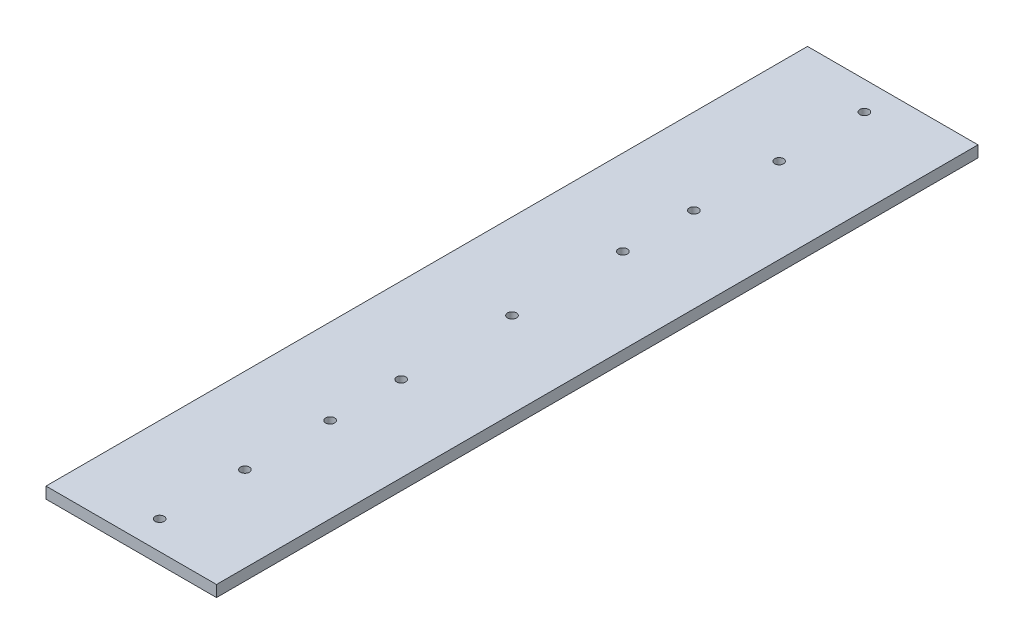
ISO-10303-21;
HEADER;
FILE_DESCRIPTION(('STEP AP214'),'2;1');
FILE_NAME('part.step','',(''),(''),'','','');
FILE_SCHEMA(('AUTOMOTIVE_DESIGN { 1 0 10303 214 1 1 1 1 }'));
ENDSEC;
DATA;
#1=APPLICATION_CONTEXT('core data for automotive mechanical design processes');
#2=APPLICATION_PROTOCOL_DEFINITION('international standard','automotive_design',2000,#1);
#3=PRODUCT_CONTEXT('',#1,'mechanical');
#4=PRODUCT('Part','Part','',(#3));
#5=PRODUCT_RELATED_PRODUCT_CATEGORY('part','',(#4));
#6=PRODUCT_DEFINITION_FORMATION('','',#4);
#7=PRODUCT_DEFINITION_CONTEXT('part definition',#1,'design');
#8=PRODUCT_DEFINITION('design','',#6,#7);
#9=PRODUCT_DEFINITION_SHAPE('','',#8);
#10=(LENGTH_UNIT() NAMED_UNIT(*) SI_UNIT(.MILLI.,.METRE.));
#11=(NAMED_UNIT(*) PLANE_ANGLE_UNIT() SI_UNIT($,.RADIAN.));
#12=(NAMED_UNIT(*) SI_UNIT($,.STERADIAN.) SOLID_ANGLE_UNIT());
#13=UNCERTAINTY_MEASURE_WITH_UNIT(LENGTH_MEASURE(1.E-05),#10,'distance_accuracy_value','');
#14=(GEOMETRIC_REPRESENTATION_CONTEXT(3) GLOBAL_UNCERTAINTY_ASSIGNED_CONTEXT((#13)) GLOBAL_UNIT_ASSIGNED_CONTEXT((#10,
#11,#12)) REPRESENTATION_CONTEXT('',''));
#15=CARTESIAN_POINT('',(0.,0.,0.));
#16=DIRECTION('',(0.,0.,1.));
#17=DIRECTION('',(1.,0.,0.));
#18=AXIS2_PLACEMENT_3D('',#15,#16,#17);
#19=CARTESIAN_POINT('',(0.,4.,0.));
#20=DIRECTION('',(0.,1.,0.));
#21=DIRECTION('',(0.,0.,1.));
#22=AXIS2_PLACEMENT_3D('',#19,#20,#21);
#23=PLANE('',#22);
#24=CARTESIAN_POINT('',(-95.4545454545455,4.,0.227272727272701));
#25=DIRECTION('',(0.,1.,0.));
#26=DIRECTION('',(0.,0.,1.));
#27=AXIS2_PLACEMENT_3D('',#24,#25,#26);
#28=CIRCLE('',#27,1.58);
#29=CARTESIAN_POINT('',(-95.4545454545455,4.,1.8072727272727));
#30=VERTEX_POINT('',#29);
#31=EDGE_CURVE('E185',#30,#30,#28,.T.);
#32=ORIENTED_EDGE('',*,*,#31,.F.);
#33=EDGE_LOOP('',(#32));
#34=FACE_BOUND('',#33,.T.);
#35=CARTESIAN_POINT('',(-95.4545454545455,4.,-54.7727272727273));
#36=DIRECTION('',(0.,1.,0.));
#37=DIRECTION('',(0.,0.,1.));
#38=AXIS2_PLACEMENT_3D('',#35,#36,#37);
#39=CIRCLE('',#38,1.58);
#40=CARTESIAN_POINT('',(-95.4545454545455,4.,-53.1927272727273));
#41=VERTEX_POINT('',#40);
#42=EDGE_CURVE('E169',#41,#41,#39,.T.);
#43=ORIENTED_EDGE('',*,*,#42,.F.);
#44=EDGE_LOOP('',(#43));
#45=FACE_BOUND('',#44,.T.);
#46=CARTESIAN_POINT('',(-95.4545454545455,4.,-132.772727272727));
#47=DIRECTION('',(0.,1.,0.));
#48=DIRECTION('',(0.,0.,1.));
#49=AXIS2_PLACEMENT_3D('',#46,#47,#48);
#50=CIRCLE('',#49,1.57999999999999);
#51=CARTESIAN_POINT('',(-95.4545454545455,4.,-131.192727272727));
#52=VERTEX_POINT('',#51);
#53=EDGE_CURVE('E153',#52,#52,#50,.T.);
#54=ORIENTED_EDGE('',*,*,#53,.F.);
#55=EDGE_LOOP('',(#54));
#56=FACE_BOUND('',#55,.T.);
#57=CARTESIAN_POINT('',(-95.4545454545455,4.,-187.772727272727));
#58=DIRECTION('',(0.,1.,0.));
#59=DIRECTION('',(0.,0.,1.));
#60=AXIS2_PLACEMENT_3D('',#57,#58,#59);
#61=CIRCLE('',#60,1.57999999999999);
#62=CARTESIAN_POINT('',(-95.4545454545455,4.,-186.192727272727));
#63=VERTEX_POINT('',#62);
#64=EDGE_CURVE('E137',#63,#63,#61,.T.);
#65=ORIENTED_EDGE('',*,*,#64,.F.);
#66=EDGE_LOOP('',(#65));
#67=FACE_BOUND('',#66,.T.);
#68=DIRECTION('',(0.,0.,-1.));
#69=VECTOR('',#68,1.);
#70=CARTESIAN_POINT('',(-65.4545454545455,4.,-227.772727272727));
#71=LINE('',#70,#69);
#72=CARTESIAN_POINT('',(-65.4545454545455,4.,40.2272727272727));
#73=VERTEX_POINT('',#72);
#74=CARTESIAN_POINT('',(-65.4545454545455,4.,-227.772727272727));
#75=VERTEX_POINT('',#74);
#76=EDGE_CURVE('E95',#73,#75,#71,.T.);
#77=ORIENTED_EDGE('',*,*,#76,.T.);
#78=DIRECTION('',(-1.,0.,0.));
#79=VECTOR('',#78,1.);
#80=CARTESIAN_POINT('',(-125.454545454545,4.,-227.772727272727));
#81=LINE('',#80,#79);
#82=CARTESIAN_POINT('',(-125.454545454545,4.,-227.772727272727));
#83=VERTEX_POINT('',#82);
#84=EDGE_CURVE('E90',#75,#83,#81,.T.);
#85=ORIENTED_EDGE('',*,*,#84,.T.);
#86=DIRECTION('',(0.,0.,1.));
#87=VECTOR('',#86,1.);
#88=CARTESIAN_POINT('',(-125.454545454545,4.,-227.772727272727));
#89=LINE('',#88,#87);
#90=CARTESIAN_POINT('',(-125.454545454545,4.,40.2272727272727));
#91=VERTEX_POINT('',#90);
#92=EDGE_CURVE('E93',#83,#91,#89,.T.);
#93=ORIENTED_EDGE('',*,*,#92,.T.);
#94=DIRECTION('',(1.,0.,0.));
#95=VECTOR('',#94,1.);
#96=CARTESIAN_POINT('',(-125.454545454545,4.,40.2272727272727));
#97=LINE('',#96,#95);
#98=EDGE_CURVE('E60',#91,#73,#97,.T.);
#99=ORIENTED_EDGE('',*,*,#98,.T.);
#100=EDGE_LOOP('',(#77,#85,#93,#99));
#101=FACE_BOUND('',#100,.T.);
#102=CARTESIAN_POINT('',(-95.4545454545455,4.,-217.772727272727));
#103=DIRECTION('',(0.,1.,0.));
#104=DIRECTION('',(0.,0.,1.));
#105=AXIS2_PLACEMENT_3D('',#102,#103,#104);
#106=CIRCLE('',#105,1.57999999999999);
#107=CARTESIAN_POINT('',(-95.4545454545455,4.,-216.192727272727));
#108=VERTEX_POINT('',#107);
#109=EDGE_CURVE('E115',#108,#108,#106,.T.);
#110=ORIENTED_EDGE('',*,*,#109,.F.);
#111=EDGE_LOOP('',(#110));
#112=FACE_BOUND('',#111,.T.);
#113=CARTESIAN_POINT('',(-95.4545454545455,4.,-157.772727272727));
#114=DIRECTION('',(0.,1.,0.));
#115=DIRECTION('',(0.,0.,1.));
#116=AXIS2_PLACEMENT_3D('',#113,#114,#115);
#117=CIRCLE('',#116,1.57999999999999);
#118=CARTESIAN_POINT('',(-95.4545454545455,4.,-156.192727272727));
#119=VERTEX_POINT('',#118);
#120=EDGE_CURVE('E145',#119,#119,#117,.T.);
#121=ORIENTED_EDGE('',*,*,#120,.F.);
#122=EDGE_LOOP('',(#121));
#123=FACE_BOUND('',#122,.T.);
#124=CARTESIAN_POINT('',(-95.4545454545455,4.,-93.7727272727273));
#125=DIRECTION('',(0.,1.,0.));
#126=DIRECTION('',(0.,0.,1.));
#127=AXIS2_PLACEMENT_3D('',#124,#125,#126);
#128=CIRCLE('',#127,1.58);
#129=CARTESIAN_POINT('',(-95.4545454545455,4.,-92.1927272727273));
#130=VERTEX_POINT('',#129);
#131=EDGE_CURVE('E161',#130,#130,#128,.T.);
#132=ORIENTED_EDGE('',*,*,#131,.F.);
#133=EDGE_LOOP('',(#132));
#134=FACE_BOUND('',#133,.T.);
#135=CARTESIAN_POINT('',(-95.4545454545455,4.,-29.7727272727273));
#136=DIRECTION('',(0.,1.,0.));
#137=DIRECTION('',(0.,0.,1.));
#138=AXIS2_PLACEMENT_3D('',#135,#136,#137);
#139=CIRCLE('',#138,1.58);
#140=CARTESIAN_POINT('',(-95.4545454545455,4.,-28.1927272727273));
#141=VERTEX_POINT('',#140);
#142=EDGE_CURVE('E177',#141,#141,#139,.T.);
#143=ORIENTED_EDGE('',*,*,#142,.F.);
#144=EDGE_LOOP('',(#143));
#145=FACE_BOUND('',#144,.T.);
#146=CARTESIAN_POINT('',(-95.4545454545455,4.,30.2272727272727));
#147=DIRECTION('',(0.,1.,0.));
#148=DIRECTION('',(0.,0.,1.));
#149=AXIS2_PLACEMENT_3D('',#146,#147,#148);
#150=CIRCLE('',#149,1.58);
#151=CARTESIAN_POINT('',(-95.4545454545455,4.,31.8072727272727));
#152=VERTEX_POINT('',#151);
#153=EDGE_CURVE('E193',#152,#152,#150,.T.);
#154=ORIENTED_EDGE('',*,*,#153,.F.);
#155=EDGE_LOOP('',(#154));
#156=FACE_BOUND('',#155,.T.);
#157=ADVANCED_FACE('F42',(#34,#45,#56,#67,#101,#112,#123,#134,#145,#156),#23,.T.);
#158=CARTESIAN_POINT('',(0.,0.,0.));
#159=DIRECTION('',(0.,1.,0.));
#160=DIRECTION('',(0.,0.,1.));
#161=AXIS2_PLACEMENT_3D('',#158,#159,#160);
#162=PLANE('',#161);
#163=DIRECTION('',(0.,0.,-1.));
#164=VECTOR('',#163,1.);
#165=CARTESIAN_POINT('',(-65.4545454545455,0.,-227.772727272727));
#166=LINE('',#165,#164);
#167=CARTESIAN_POINT('',(-65.4545454545455,0.,40.2272727272727));
#168=VERTEX_POINT('',#167);
#169=CARTESIAN_POINT('',(-65.4545454545455,0.,-227.772727272727));
#170=VERTEX_POINT('',#169);
#171=EDGE_CURVE('E111',#168,#170,#166,.T.);
#172=ORIENTED_EDGE('',*,*,#171,.F.);
#173=DIRECTION('',(1.,0.,0.));
#174=VECTOR('',#173,1.);
#175=CARTESIAN_POINT('',(-125.454545454545,0.,40.2272727272727));
#176=LINE('',#175,#174);
#177=CARTESIAN_POINT('',(-125.454545454545,0.,40.2272727272727));
#178=VERTEX_POINT('',#177);
#179=EDGE_CURVE('E83',#178,#168,#176,.T.);
#180=ORIENTED_EDGE('',*,*,#179,.F.);
#181=DIRECTION('',(0.,0.,1.));
#182=VECTOR('',#181,1.);
#183=CARTESIAN_POINT('',(-125.454545454545,0.,-227.772727272727));
#184=LINE('',#183,#182);
#185=CARTESIAN_POINT('',(-125.454545454545,0.,-227.772727272727));
#186=VERTEX_POINT('',#185);
#187=EDGE_CURVE('E77',#186,#178,#184,.T.);
#188=ORIENTED_EDGE('',*,*,#187,.F.);
#189=DIRECTION('',(-1.,0.,0.));
#190=VECTOR('',#189,1.);
#191=CARTESIAN_POINT('',(-125.454545454545,0.,-227.772727272727));
#192=LINE('',#191,#190);
#193=EDGE_CURVE('E100',#170,#186,#192,.T.);
#194=ORIENTED_EDGE('',*,*,#193,.F.);
#195=EDGE_LOOP('',(#172,#180,#188,#194));
#196=FACE_BOUND('',#195,.T.);
#197=CARTESIAN_POINT('',(-95.4545454545455,0.,-217.772727272727));
#198=DIRECTION('',(0.,1.,0.));
#199=DIRECTION('',(0.,0.,1.));
#200=AXIS2_PLACEMENT_3D('',#197,#198,#199);
#201=CIRCLE('',#200,1.57999999999999);
#202=CARTESIAN_POINT('',(-95.4545454545455,0.,-216.192727272727));
#203=VERTEX_POINT('',#202);
#204=EDGE_CURVE('E133',#203,#203,#201,.T.);
#205=ORIENTED_EDGE('',*,*,#204,.T.);
#206=EDGE_LOOP('',(#205));
#207=FACE_BOUND('',#206,.T.);
#208=CARTESIAN_POINT('',(-95.4545454545455,0.,-187.772727272727));
#209=DIRECTION('',(0.,1.,0.));
#210=DIRECTION('',(0.,0.,1.));
#211=AXIS2_PLACEMENT_3D('',#208,#209,#210);
#212=CIRCLE('',#211,1.57999999999999);
#213=CARTESIAN_POINT('',(-95.4545454545455,0.,-186.192727272727));
#214=VERTEX_POINT('',#213);
#215=EDGE_CURVE('E141',#214,#214,#212,.T.);
#216=ORIENTED_EDGE('',*,*,#215,.T.);
#217=EDGE_LOOP('',(#216));
#218=FACE_BOUND('',#217,.T.);
#219=CARTESIAN_POINT('',(-95.4545454545455,0.,-157.772727272727));
#220=DIRECTION('',(0.,1.,0.));
#221=DIRECTION('',(0.,0.,1.));
#222=AXIS2_PLACEMENT_3D('',#219,#220,#221);
#223=CIRCLE('',#222,1.57999999999999);
#224=CARTESIAN_POINT('',(-95.4545454545455,0.,-156.192727272727));
#225=VERTEX_POINT('',#224);
#226=EDGE_CURVE('E149',#225,#225,#223,.T.);
#227=ORIENTED_EDGE('',*,*,#226,.T.);
#228=EDGE_LOOP('',(#227));
#229=FACE_BOUND('',#228,.T.);
#230=CARTESIAN_POINT('',(-95.4545454545455,0.,-132.772727272727));
#231=DIRECTION('',(0.,1.,0.));
#232=DIRECTION('',(0.,0.,1.));
#233=AXIS2_PLACEMENT_3D('',#230,#231,#232);
#234=CIRCLE('',#233,1.57999999999999);
#235=CARTESIAN_POINT('',(-95.4545454545455,0.,-131.192727272727));
#236=VERTEX_POINT('',#235);
#237=EDGE_CURVE('E157',#236,#236,#234,.T.);
#238=ORIENTED_EDGE('',*,*,#237,.T.);
#239=EDGE_LOOP('',(#238));
#240=FACE_BOUND('',#239,.T.);
#241=CARTESIAN_POINT('',(-95.4545454545455,0.,-93.7727272727273));
#242=DIRECTION('',(0.,1.,0.));
#243=DIRECTION('',(0.,0.,1.));
#244=AXIS2_PLACEMENT_3D('',#241,#242,#243);
#245=CIRCLE('',#244,1.58);
#246=CARTESIAN_POINT('',(-95.4545454545455,0.,-92.1927272727273));
#247=VERTEX_POINT('',#246);
#248=EDGE_CURVE('E165',#247,#247,#245,.T.);
#249=ORIENTED_EDGE('',*,*,#248,.T.);
#250=EDGE_LOOP('',(#249));
#251=FACE_BOUND('',#250,.T.);
#252=CARTESIAN_POINT('',(-95.4545454545455,0.,-54.7727272727273));
#253=DIRECTION('',(0.,1.,0.));
#254=DIRECTION('',(0.,0.,1.));
#255=AXIS2_PLACEMENT_3D('',#252,#253,#254);
#256=CIRCLE('',#255,1.58);
#257=CARTESIAN_POINT('',(-95.4545454545455,0.,-53.1927272727273));
#258=VERTEX_POINT('',#257);
#259=EDGE_CURVE('E173',#258,#258,#256,.T.);
#260=ORIENTED_EDGE('',*,*,#259,.T.);
#261=EDGE_LOOP('',(#260));
#262=FACE_BOUND('',#261,.T.);
#263=CARTESIAN_POINT('',(-95.4545454545455,0.,-29.7727272727273));
#264=DIRECTION('',(0.,1.,0.));
#265=DIRECTION('',(0.,0.,1.));
#266=AXIS2_PLACEMENT_3D('',#263,#264,#265);
#267=CIRCLE('',#266,1.58);
#268=CARTESIAN_POINT('',(-95.4545454545455,0.,-28.1927272727273));
#269=VERTEX_POINT('',#268);
#270=EDGE_CURVE('E181',#269,#269,#267,.T.);
#271=ORIENTED_EDGE('',*,*,#270,.T.);
#272=EDGE_LOOP('',(#271));
#273=FACE_BOUND('',#272,.T.);
#274=CARTESIAN_POINT('',(-95.4545454545455,0.,0.227272727272701));
#275=DIRECTION('',(0.,1.,0.));
#276=DIRECTION('',(0.,0.,1.));
#277=AXIS2_PLACEMENT_3D('',#274,#275,#276);
#278=CIRCLE('',#277,1.58);
#279=CARTESIAN_POINT('',(-95.4545454545455,0.,1.8072727272727));
#280=VERTEX_POINT('',#279);
#281=EDGE_CURVE('E189',#280,#280,#278,.T.);
#282=ORIENTED_EDGE('',*,*,#281,.T.);
#283=EDGE_LOOP('',(#282));
#284=FACE_BOUND('',#283,.T.);
#285=CARTESIAN_POINT('',(-95.4545454545455,0.,30.2272727272727));
#286=DIRECTION('',(0.,1.,0.));
#287=DIRECTION('',(0.,0.,1.));
#288=AXIS2_PLACEMENT_3D('',#285,#286,#287);
#289=CIRCLE('',#288,1.58);
#290=CARTESIAN_POINT('',(-95.4545454545455,0.,31.8072727272727));
#291=VERTEX_POINT('',#290);
#292=EDGE_CURVE('E197',#291,#291,#289,.T.);
#293=ORIENTED_EDGE('',*,*,#292,.T.);
#294=EDGE_LOOP('',(#293));
#295=FACE_BOUND('',#294,.T.);
#296=ADVANCED_FACE('F128',(#196,#207,#218,#229,#240,#251,#262,#273,#284,#295),#162,.F.);
#297=CARTESIAN_POINT('',(-65.4545454545455,4.,-227.772727272727));
#298=DIRECTION('',(-1.,0.,0.));
#299=DIRECTION('',(0.,0.,1.));
#300=AXIS2_PLACEMENT_3D('',#297,#298,#299);
#301=PLANE('',#300);
#302=ORIENTED_EDGE('',*,*,#171,.T.);
#303=DIRECTION('',(0.,-1.,0.));
#304=VECTOR('',#303,1.);
#305=CARTESIAN_POINT('',(-65.4545454545455,4.,-227.772727272727));
#306=LINE('',#305,#304);
#307=EDGE_CURVE('E11',#75,#170,#306,.T.);
#308=ORIENTED_EDGE('',*,*,#307,.F.);
#309=ORIENTED_EDGE('',*,*,#76,.F.);
#310=DIRECTION('',(0.,-1.,0.));
#311=VECTOR('',#310,1.);
#312=CARTESIAN_POINT('',(-65.4545454545455,4.,40.2272727272727));
#313=LINE('',#312,#311);
#314=EDGE_CURVE('E107',#73,#168,#313,.T.);
#315=ORIENTED_EDGE('',*,*,#314,.T.);
#316=EDGE_LOOP('',(#302,#308,#309,#315));
#317=FACE_BOUND('',#316,.T.);
#318=ADVANCED_FACE('F44',(#317),#301,.F.);
#319=CARTESIAN_POINT('',(-125.454545454545,4.,-227.772727272727));
#320=DIRECTION('',(0.,0.,1.));
#321=DIRECTION('',(1.,0.,0.));
#322=AXIS2_PLACEMENT_3D('',#319,#320,#321);
#323=PLANE('',#322);
#324=ORIENTED_EDGE('',*,*,#193,.T.);
#325=DIRECTION('',(0.,-1.,0.));
#326=VECTOR('',#325,1.);
#327=CARTESIAN_POINT('',(-125.454545454545,4.,-227.772727272727));
#328=LINE('',#327,#326);
#329=EDGE_CURVE('E52',#83,#186,#328,.T.);
#330=ORIENTED_EDGE('',*,*,#329,.F.);
#331=ORIENTED_EDGE('',*,*,#84,.F.);
#332=ORIENTED_EDGE('',*,*,#307,.T.);
#333=EDGE_LOOP('',(#324,#330,#331,#332));
#334=FACE_BOUND('',#333,.T.);
#335=ADVANCED_FACE('F99',(#334),#323,.F.);
#336=CARTESIAN_POINT('',(-125.454545454545,4.,-227.772727272727));
#337=DIRECTION('',(1.,0.,0.));
#338=DIRECTION('',(0.,0.,-1.));
#339=AXIS2_PLACEMENT_3D('',#336,#337,#338);
#340=PLANE('',#339);
#341=ORIENTED_EDGE('',*,*,#187,.T.);
#342=DIRECTION('',(0.,-1.,0.));
#343=VECTOR('',#342,1.);
#344=CARTESIAN_POINT('',(-125.454545454545,4.,40.2272727272727));
#345=LINE('',#344,#343);
#346=EDGE_CURVE('E102',#91,#178,#345,.T.);
#347=ORIENTED_EDGE('',*,*,#346,.F.);
#348=ORIENTED_EDGE('',*,*,#92,.F.);
#349=ORIENTED_EDGE('',*,*,#329,.T.);
#350=EDGE_LOOP('',(#341,#347,#348,#349));
#351=FACE_BOUND('',#350,.T.);
#352=ADVANCED_FACE('F103',(#351),#340,.F.);
#353=CARTESIAN_POINT('',(-125.454545454545,4.,40.2272727272727));
#354=DIRECTION('',(0.,0.,-1.));
#355=DIRECTION('',(-1.,0.,0.));
#356=AXIS2_PLACEMENT_3D('',#353,#354,#355);
#357=PLANE('',#356);
#358=ORIENTED_EDGE('',*,*,#179,.T.);
#359=ORIENTED_EDGE('',*,*,#314,.F.);
#360=ORIENTED_EDGE('',*,*,#98,.F.);
#361=ORIENTED_EDGE('',*,*,#346,.T.);
#362=EDGE_LOOP('',(#358,#359,#360,#361));
#363=FACE_BOUND('',#362,.T.);
#364=ADVANCED_FACE('F125',(#363),#357,.F.);
#365=CARTESIAN_POINT('',(-95.4545454545455,4.,-217.772727272727));
#366=DIRECTION('',(0.,-1.,0.));
#367=DIRECTION('',(0.,0.,-1.));
#368=AXIS2_PLACEMENT_3D('',#365,#366,#367);
#369=CYLINDRICAL_SURFACE('',#368,1.57999999999999);
#370=ORIENTED_EDGE('',*,*,#109,.T.);
#371=EDGE_LOOP('',(#370));
#372=FACE_BOUND('',#371,.T.);
#373=ORIENTED_EDGE('',*,*,#204,.F.);
#374=EDGE_LOOP('',(#373));
#375=FACE_BOUND('',#374,.T.);
#376=ADVANCED_FACE('F218',(#372,#375),#369,.F.);
#377=CARTESIAN_POINT('',(-95.4545454545455,4.,-187.772727272727));
#378=DIRECTION('',(0.,-1.,0.));
#379=DIRECTION('',(0.,0.,-1.));
#380=AXIS2_PLACEMENT_3D('',#377,#378,#379);
#381=CYLINDRICAL_SURFACE('',#380,1.57999999999999);
#382=ORIENTED_EDGE('',*,*,#64,.T.);
#383=EDGE_LOOP('',(#382));
#384=FACE_BOUND('',#383,.T.);
#385=ORIENTED_EDGE('',*,*,#215,.F.);
#386=EDGE_LOOP('',(#385));
#387=FACE_BOUND('',#386,.T.);
#388=ADVANCED_FACE('F272',(#384,#387),#381,.F.);
#389=CARTESIAN_POINT('',(-95.4545454545455,4.,-157.772727272727));
#390=DIRECTION('',(0.,-1.,0.));
#391=DIRECTION('',(0.,0.,-1.));
#392=AXIS2_PLACEMENT_3D('',#389,#390,#391);
#393=CYLINDRICAL_SURFACE('',#392,1.57999999999999);
#394=ORIENTED_EDGE('',*,*,#120,.T.);
#395=EDGE_LOOP('',(#394));
#396=FACE_BOUND('',#395,.T.);
#397=ORIENTED_EDGE('',*,*,#226,.F.);
#398=EDGE_LOOP('',(#397));
#399=FACE_BOUND('',#398,.T.);
#400=ADVANCED_FACE('F281',(#396,#399),#393,.F.);
#401=CARTESIAN_POINT('',(-95.4545454545455,4.,-132.772727272727));
#402=DIRECTION('',(0.,-1.,0.));
#403=DIRECTION('',(0.,0.,-1.));
#404=AXIS2_PLACEMENT_3D('',#401,#402,#403);
#405=CYLINDRICAL_SURFACE('',#404,1.57999999999999);
#406=ORIENTED_EDGE('',*,*,#53,.T.);
#407=EDGE_LOOP('',(#406));
#408=FACE_BOUND('',#407,.T.);
#409=ORIENTED_EDGE('',*,*,#237,.F.);
#410=EDGE_LOOP('',(#409));
#411=FACE_BOUND('',#410,.T.);
#412=ADVANCED_FACE('F290',(#408,#411),#405,.F.);
#413=CARTESIAN_POINT('',(-95.4545454545455,4.,-93.7727272727273));
#414=DIRECTION('',(0.,-1.,0.));
#415=DIRECTION('',(0.,0.,-1.));
#416=AXIS2_PLACEMENT_3D('',#413,#414,#415);
#417=CYLINDRICAL_SURFACE('',#416,1.58);
#418=ORIENTED_EDGE('',*,*,#131,.T.);
#419=EDGE_LOOP('',(#418));
#420=FACE_BOUND('',#419,.T.);
#421=ORIENTED_EDGE('',*,*,#248,.F.);
#422=EDGE_LOOP('',(#421));
#423=FACE_BOUND('',#422,.T.);
#424=ADVANCED_FACE('F300',(#420,#423),#417,.F.);
#425=CARTESIAN_POINT('',(-95.4545454545455,4.,-54.7727272727273));
#426=DIRECTION('',(0.,-1.,0.));
#427=DIRECTION('',(0.,0.,-1.));
#428=AXIS2_PLACEMENT_3D('',#425,#426,#427);
#429=CYLINDRICAL_SURFACE('',#428,1.58);
#430=ORIENTED_EDGE('',*,*,#42,.T.);
#431=EDGE_LOOP('',(#430));
#432=FACE_BOUND('',#431,.T.);
#433=ORIENTED_EDGE('',*,*,#259,.F.);
#434=EDGE_LOOP('',(#433));
#435=FACE_BOUND('',#434,.T.);
#436=ADVANCED_FACE('F310',(#432,#435),#429,.F.);
#437=CARTESIAN_POINT('',(-95.4545454545455,4.,-29.7727272727273));
#438=DIRECTION('',(0.,-1.,0.));
#439=DIRECTION('',(0.,0.,-1.));
#440=AXIS2_PLACEMENT_3D('',#437,#438,#439);
#441=CYLINDRICAL_SURFACE('',#440,1.58);
#442=ORIENTED_EDGE('',*,*,#142,.T.);
#443=EDGE_LOOP('',(#442));
#444=FACE_BOUND('',#443,.T.);
#445=ORIENTED_EDGE('',*,*,#270,.F.);
#446=EDGE_LOOP('',(#445));
#447=FACE_BOUND('',#446,.T.);
#448=ADVANCED_FACE('F320',(#444,#447),#441,.F.);
#449=CARTESIAN_POINT('',(-95.4545454545455,4.,0.227272727272701));
#450=DIRECTION('',(0.,-1.,0.));
#451=DIRECTION('',(0.,0.,-1.));
#452=AXIS2_PLACEMENT_3D('',#449,#450,#451);
#453=CYLINDRICAL_SURFACE('',#452,1.58);
#454=ORIENTED_EDGE('',*,*,#31,.T.);
#455=EDGE_LOOP('',(#454));
#456=FACE_BOUND('',#455,.T.);
#457=ORIENTED_EDGE('',*,*,#281,.F.);
#458=EDGE_LOOP('',(#457));
#459=FACE_BOUND('',#458,.T.);
#460=ADVANCED_FACE('F330',(#456,#459),#453,.F.);
#461=CARTESIAN_POINT('',(-95.4545454545455,4.,30.2272727272727));
#462=DIRECTION('',(0.,-1.,0.));
#463=DIRECTION('',(0.,0.,-1.));
#464=AXIS2_PLACEMENT_3D('',#461,#462,#463);
#465=CYLINDRICAL_SURFACE('',#464,1.58);
#466=ORIENTED_EDGE('',*,*,#153,.T.);
#467=EDGE_LOOP('',(#466));
#468=FACE_BOUND('',#467,.T.);
#469=ORIENTED_EDGE('',*,*,#292,.F.);
#470=EDGE_LOOP('',(#469));
#471=FACE_BOUND('',#470,.T.);
#472=ADVANCED_FACE('F205',(#468,#471),#465,.F.);
#473=CLOSED_SHELL('',(#157,#296,#318,#335,#352,#364,#376,#388,#400,#412,#424,#436,#448,#460,#472));
#474=MANIFOLD_SOLID_BREP('B2',#473);
#475=ADVANCED_BREP_SHAPE_REPRESENTATION('',(#18,#474),#14);
#476=SHAPE_DEFINITION_REPRESENTATION(#9,#475);
ENDSEC;
END-ISO-10303-21;
